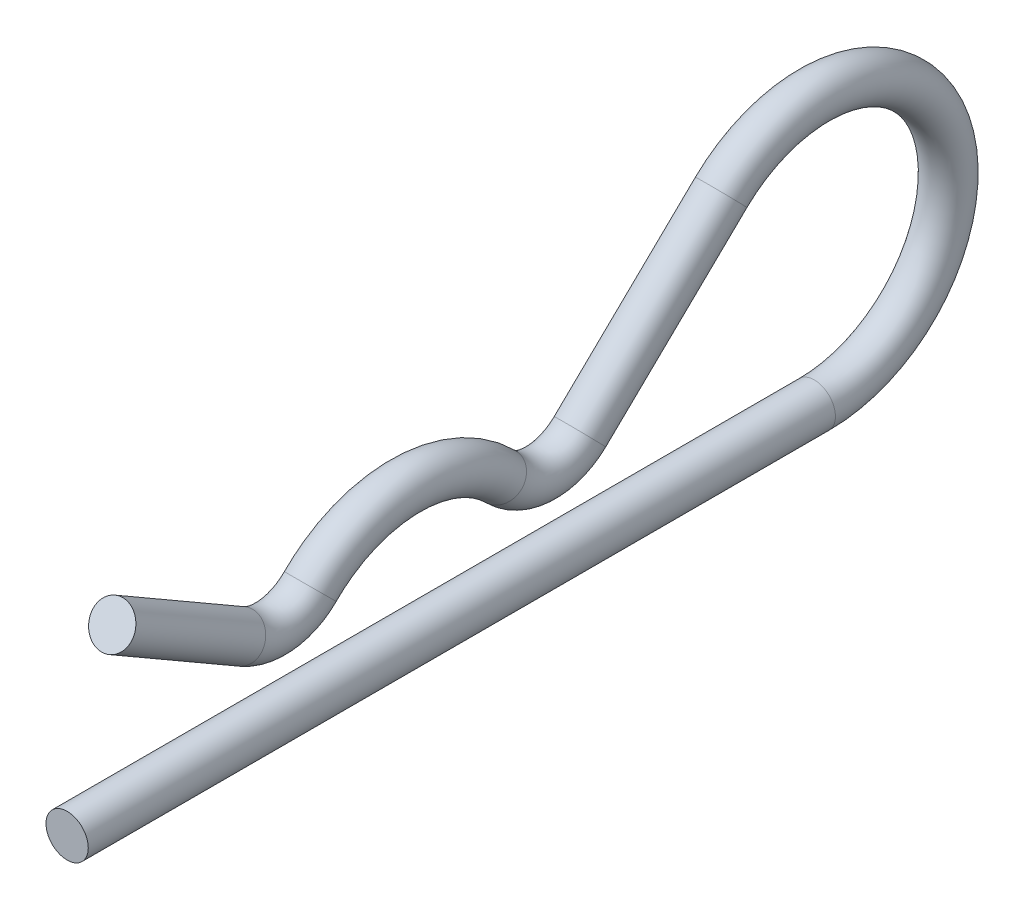
ISO-10303-21;
HEADER;
FILE_DESCRIPTION(('STEP AP214'),'2;1');
FILE_NAME('part.step','',(''),(''),'','','');
FILE_SCHEMA(('AUTOMOTIVE_DESIGN { 1 0 10303 214 1 1 1 1 }'));
ENDSEC;
DATA;
#1=APPLICATION_CONTEXT('core data for automotive mechanical design processes');
#2=APPLICATION_PROTOCOL_DEFINITION('international standard','automotive_design',2000,#1);
#3=PRODUCT_CONTEXT('',#1,'mechanical');
#4=PRODUCT('Part','Part','',(#3));
#5=PRODUCT_RELATED_PRODUCT_CATEGORY('part','',(#4));
#6=PRODUCT_DEFINITION_FORMATION('','',#4);
#7=PRODUCT_DEFINITION_CONTEXT('part definition',#1,'design');
#8=PRODUCT_DEFINITION('design','',#6,#7);
#9=PRODUCT_DEFINITION_SHAPE('','',#8);
#10=(LENGTH_UNIT() NAMED_UNIT(*) SI_UNIT(.MILLI.,.METRE.));
#11=(NAMED_UNIT(*) PLANE_ANGLE_UNIT() SI_UNIT($,.RADIAN.));
#12=(NAMED_UNIT(*) SI_UNIT($,.STERADIAN.) SOLID_ANGLE_UNIT());
#13=UNCERTAINTY_MEASURE_WITH_UNIT(LENGTH_MEASURE(1.E-05),#10,'distance_accuracy_value','');
#14=(GEOMETRIC_REPRESENTATION_CONTEXT(3) GLOBAL_UNCERTAINTY_ASSIGNED_CONTEXT((#13)) GLOBAL_UNIT_ASSIGNED_CONTEXT((#10,
#11,#12)) REPRESENTATION_CONTEXT('',''));
#15=CARTESIAN_POINT('',(0.,0.,0.));
#16=DIRECTION('',(0.,0.,1.));
#17=DIRECTION('',(1.,0.,0.));
#18=AXIS2_PLACEMENT_3D('',#15,#16,#17);
#19=CARTESIAN_POINT('',(0.,2.39549717149222,-4.92455872837049));
#20=DIRECTION('',(0.,0.499999999999992,0.866025403784443));
#21=DIRECTION('',(0.,-0.866025403784444,0.499999999999992));
#22=AXIS2_PLACEMENT_3D('',#19,#20,#21);
#23=CYLINDRICAL_SURFACE('',#22,0.5953125);
#24=CARTESIAN_POINT('',(0.,2.39549717149222,-4.92455872837049));
#25=DIRECTION('',(0.,-0.499999999999982,-0.866025403784449));
#26=DIRECTION('',(1.,0.,0.));
#27=AXIS2_PLACEMENT_3D('',#24,#25,#26);
#28=CIRCLE('',#27,0.5953125);
#29=CARTESIAN_POINT('',(0.,1.87994142330179,-4.62690247837051));
#30=VERTEX_POINT('',#29);
#31=EDGE_CURVE('E36',#30,#30,#28,.T.);
#32=CARTESIAN_POINT('',(0.,4.5054576370862,-1.26999999999995));
#33=DIRECTION('',(0.,-0.499999999999982,-0.866025403784449));
#34=DIRECTION('',(1.,0.,0.));
#35=AXIS2_PLACEMENT_3D('',#32,#33,#34);
#36=CIRCLE('',#35,0.5953125);
#37=CARTESIAN_POINT('',(0.,3.98990188889578,-0.972343749999964));
#38=VERTEX_POINT('',#37);
#39=EDGE_CURVE('E10',#38,#38,#36,.T.);
#40=CARTESIAN_POINT('',(0.,1.87994142330179,-4.62690247837051));
#41=CARTESIAN_POINT('',(0.,1.90192017815173,-4.58883415828331));
#42=CARTESIAN_POINT('',(0.,1.92389893300167,-4.55076583819612));
#43=CARTESIAN_POINT('',(0.,1.96785644270154,-4.47462919802173));
#44=CARTESIAN_POINT('',(0.,1.98983519755148,-4.43656087793454));
#45=CARTESIAN_POINT('',(0.,2.03379270725135,-4.36042423776015));
#46=CARTESIAN_POINT('',(0.,2.05577146210129,-4.32235591767296));
#47=CARTESIAN_POINT('',(0.,2.09972897180117,-4.24621927749857));
#48=CARTESIAN_POINT('',(0.,2.1217077266511,-4.20815095741138));
#49=CARTESIAN_POINT('',(0.,2.16566523635098,-4.13201431723699));
#50=CARTESIAN_POINT('',(0.,2.18764399120092,-4.0939459971498));
#51=CARTESIAN_POINT('',(0.,2.23160150090079,-4.01780935697542));
#52=CARTESIAN_POINT('',(0.,2.25358025575073,-3.97974103688822));
#53=CARTESIAN_POINT('',(0.,2.2975377654506,-3.90360439671384));
#54=CARTESIAN_POINT('',(0.,2.31951652030054,-3.86553607662664));
#55=CARTESIAN_POINT('',(0.,2.36347403000041,-3.78939943645226));
#56=CARTESIAN_POINT('',(0.,2.38545278485035,-3.75133111636506));
#57=CARTESIAN_POINT('',(0.,2.42941029455023,-3.67519447619068));
#58=CARTESIAN_POINT('',(0.,2.45138904940016,-3.63712615610348));
#59=CARTESIAN_POINT('',(0.,2.49534655910004,-3.5609895159291));
#60=CARTESIAN_POINT('',(0.,2.51732531394997,-3.5229211958419));
#61=CARTESIAN_POINT('',(0.,2.56128282364985,-3.44678455566752));
#62=CARTESIAN_POINT('',(0.,2.58326157849979,-3.40871623558032));
#63=CARTESIAN_POINT('',(0.,2.62721908819966,-3.33257959540594));
#64=CARTESIAN_POINT('',(0.,2.6491978430496,-3.29451127531875));
#65=CARTESIAN_POINT('',(0.,2.69315535274947,-3.21837463514436));
#66=CARTESIAN_POINT('',(0.,2.71513410759941,-3.18030631505717));
#67=CARTESIAN_POINT('',(0.,2.75909161729929,-3.10416967488278));
#68=CARTESIAN_POINT('',(0.,2.78107037214922,-3.06610135479559));
#69=CARTESIAN_POINT('',(0.,2.8250278818491,-2.9899647146212));
#70=CARTESIAN_POINT('',(0.,2.84700663669903,-2.95189639453401));
#71=CARTESIAN_POINT('',(0.,2.89096414639891,-2.87575975435962));
#72=CARTESIAN_POINT('',(0.,2.91294290124885,-2.83769143427243));
#73=CARTESIAN_POINT('',(0.,2.95690041094872,-2.76155479409804));
#74=CARTESIAN_POINT('',(0.,2.97887916579866,-2.72348647401085));
#75=CARTESIAN_POINT('',(0.,3.02283667549853,-2.64734983383646));
#76=CARTESIAN_POINT('',(0.,3.04481543034847,-2.60928151374927));
#77=CARTESIAN_POINT('',(0.,3.08877294004835,-2.53314487357488));
#78=CARTESIAN_POINT('',(0.,3.11075169489828,-2.49507655348769));
#79=CARTESIAN_POINT('',(0.,3.15470920459816,-2.4189399133133));
#80=CARTESIAN_POINT('',(0.,3.17668795944809,-2.38087159322611));
#81=CARTESIAN_POINT('',(0.,3.22064546914797,-2.30473495305172));
#82=CARTESIAN_POINT('',(0.,3.24262422399791,-2.26666663296453));
#83=CARTESIAN_POINT('',(0.,3.28658173369778,-2.19052999279014));
#84=CARTESIAN_POINT('',(0.,3.30856048854772,-2.15246167270295));
#85=CARTESIAN_POINT('',(0.,3.35251799824759,-2.07632503252856));
#86=CARTESIAN_POINT('',(0.,3.37449675309753,-2.03825671244137));
#87=CARTESIAN_POINT('',(0.,3.4184542627974,-1.96212007226699));
#88=CARTESIAN_POINT('',(0.,3.44043301764734,-1.92405175217979));
#89=CARTESIAN_POINT('',(0.,3.48439052734722,-1.84791511200541));
#90=CARTESIAN_POINT('',(0.,3.50636928219715,-1.80984679191821));
#91=CARTESIAN_POINT('',(0.,3.55032679189703,-1.73371015174383));
#92=CARTESIAN_POINT('',(0.,3.57230554674697,-1.69564183165663));
#93=CARTESIAN_POINT('',(0.,3.61626305644684,-1.61950519148225));
#94=CARTESIAN_POINT('',(0.,3.63824181129678,-1.58143687139505));
#95=CARTESIAN_POINT('',(0.,3.68219932099665,-1.50530023122067));
#96=CARTESIAN_POINT('',(0.,3.70417807584659,-1.46723191113347));
#97=CARTESIAN_POINT('',(0.,3.74813558554646,-1.39109527095909));
#98=CARTESIAN_POINT('',(0.,3.7701143403964,-1.35302695087189));
#99=CARTESIAN_POINT('',(0.,3.81407185009628,-1.27689031069751));
#100=CARTESIAN_POINT('',(0.,3.83605060494621,-1.23882199061032));
#101=CARTESIAN_POINT('',(0.,3.88000811464609,-1.16268535043593));
#102=CARTESIAN_POINT('',(0.,3.90198686949603,-1.12461703034874));
#103=CARTESIAN_POINT('',(0.,3.9459443791959,-1.04848039017435));
#104=CARTESIAN_POINT('',(0.,3.96792313404584,-1.01041207008716));
#105=CARTESIAN_POINT('',(0.,3.98990188889578,-0.972343749999964));
#106=B_SPLINE_CURVE_WITH_KNOTS('',3,(#40,#41,#42,#43,#44,#45,#46,#47,#48,#49,#50,#51,#52,#53,
#54,#55,#56,#57,#58,#59,#60,#61,#62,#63,#64,#65,#66,#67,#68,#69,#70,#71,#72,#73,#74,#75,#76,#77,
#78,#79,#80,#81,#82,#83,#84,#85,#86,#87,#88,#89,#90,#91,#92,#93,#94,#95,#96,#97,#98,#99,#100,
#101,#102,#103,#104,#105),.UNSPECIFIED.,.F.,.F.,(4,2,2,2,2,2,2,2,2,2,2,2,2,2,2,2,2,2,2,2,2,2,2,
2,2,2,2,2,2,2,2,2,4),(0.,0.131872529099626,0.263745058199252,0.395617587298878,
0.527490116398504,0.65936264549813,0.791235174597756,0.923107703697382,1.05498023279701,
1.18685276189663,1.31872529099626,1.45059782009589,1.58247034919551,1.71434287829514,
1.84621540739476,1.97808793649439,2.10996046559402,2.24183299469364,2.37370552379327,
2.50557805289289,2.63745058199252,2.76932311109215,2.90119564019177,3.0330681692914,
3.16494069839103,3.29681322749065,3.42868575659028,3.5605582856899,3.69243081478953,
3.82430334388916,3.95617587298878,4.08804840208841,4.21992093118803),.UNSPECIFIED.);
#107=EDGE_CURVE('BSEAM30',#30,#38,#106,.T.);
#108=ORIENTED_EDGE('',*,*,#31,.F.);
#109=ORIENTED_EDGE('',*,*,#39,.T.);
#110=ORIENTED_EDGE('',*,*,#107,.T.);
#111=ORIENTED_EDGE('',*,*,#107,.F.);
#112=EDGE_LOOP('',(#108,#110,#109,#111));
#113=FACE_BOUND('',#112,.T.);
#114=ADVANCED_FACE('F30',(#113),#23,.T.);
#115=CARTESIAN_POINT('',(0.,3.7703125,-5.71830872837053));
#116=DIRECTION('',(-1.,0.,0.));
#117=DIRECTION('',(0.,0.,1.));
#118=AXIS2_PLACEMENT_3D('',#115,#116,#117);
#119=TOROIDAL_SURFACE('',#118,1.5875,0.5953125);
#120=CARTESIAN_POINT('',(0.,2.65318287037033,-6.84621725329774));
#121=DIRECTION('',(0.,0.7104935590093,-0.703703703703695));
#122=DIRECTION('',(1.,0.,0.));
#123=AXIS2_PLACEMENT_3D('',#120,#121,#122);
#124=CIRCLE('',#123,0.5953125);
#125=CARTESIAN_POINT('',(0.,2.23425925925921,-7.26918295014544));
#126=VERTEX_POINT('',#125);
#127=EDGE_CURVE('E40',#126,#126,#124,.T.);
#128=CARTESIAN_POINT('',(0.,3.7703125,-5.71830872837053));
#129=DIRECTION('',(-1.,0.,0.));
#130=DIRECTION('',(0.,0.,1.));
#131=AXIS2_PLACEMENT_3D('',#128,#129,#130);
#132=CIRCLE('',#131,2.1828125);
#133=EDGE_CURVE('',#126,#30,#132,.T.);
#134=ORIENTED_EDGE('',*,*,#127,.F.);
#135=ORIENTED_EDGE('',*,*,#31,.T.);
#136=ORIENTED_EDGE('',*,*,#133,.T.);
#137=ORIENTED_EDGE('',*,*,#133,.F.);
#138=EDGE_LOOP('',(#134,#136,#135,#137));
#139=FACE_BOUND('',#138,.T.);
#140=ADVANCED_FACE('F86',(#139),#119,.T.);
#141=CARTESIAN_POINT('',(0.,0.,-9.525));
#142=DIRECTION('',(1.,0.,0.));
#143=DIRECTION('',(0.,0.,-1.));
#144=AXIS2_PLACEMENT_3D('',#141,#142,#143);
#145=TOROIDAL_SURFACE('',#144,3.7703125,0.5953125);
#146=CARTESIAN_POINT('',(0.,2.65318287037041,-12.2037827467022));
#147=DIRECTION('',(0.,-0.710493559009283,-0.703703703703712));
#148=DIRECTION('',(1.,0.,0.));
#149=AXIS2_PLACEMENT_3D('',#146,#147,#148);
#150=CIRCLE('',#149,0.5953125);
#151=CARTESIAN_POINT('',(0.,2.23425925925931,-11.7808170498544));
#152=VERTEX_POINT('',#151);
#153=EDGE_CURVE('E44',#152,#152,#150,.T.);
#154=ORIENTED_EDGE('',*,*,#153,.F.);
#155=EDGE_LOOP('',(#154));
#156=FACE_BOUND('',#155,.T.);
#157=ORIENTED_EDGE('',*,*,#127,.T.);
#158=EDGE_LOOP('',(#157));
#159=FACE_BOUND('',#158,.T.);
#160=ADVANCED_FACE('F80',(#156,#159),#145,.T.);
#161=CARTESIAN_POINT('',(0.,3.7703125,-13.3316912716295));
#162=DIRECTION('',(-1.,0.,0.));
#163=DIRECTION('',(0.,0.,1.));
#164=AXIS2_PLACEMENT_3D('',#161,#162,#163);
#165=TOROIDAL_SURFACE('',#164,1.5875,0.5953125);
#166=CARTESIAN_POINT('',(0.,2.62977122695348,-14.4359203486227));
#167=DIRECTION('',(0.,0.69557737133438,-0.718451195619824));
#168=DIRECTION('',(1.,0.,0.));
#169=AXIS2_PLACEMENT_3D('',#166,#167,#168);
#170=CIRCLE('',#169,0.5953125);
#171=CARTESIAN_POINT('',(0.,2.20206824956103,-14.8500062524952));
#172=VERTEX_POINT('',#171);
#173=EDGE_CURVE('E49',#172,#172,#170,.T.);
#174=CARTESIAN_POINT('',(0.,3.7703125,-13.3316912716295));
#175=DIRECTION('',(-1.,0.,0.));
#176=DIRECTION('',(0.,0.,1.));
#177=AXIS2_PLACEMENT_3D('',#174,#175,#176);
#178=CIRCLE('',#177,2.1828125);
#179=EDGE_CURVE('',#172,#152,#178,.T.);
#180=ORIENTED_EDGE('',*,*,#173,.F.);
#181=ORIENTED_EDGE('',*,*,#153,.T.);
#182=ORIENTED_EDGE('',*,*,#179,.T.);
#183=ORIENTED_EDGE('',*,*,#179,.F.);
#184=EDGE_LOOP('',(#180,#182,#181,#183));
#185=FACE_BOUND('',#184,.T.);
#186=ADVANCED_FACE('F74',(#185),#165,.T.);
#187=CARTESIAN_POINT('',(0.,6.47909802348536,-18.4118309421408));
#188=DIRECTION('',(0.,-0.69557737133437,0.718451195619833));
#189=DIRECTION('',(0.,-0.718451195619833,-0.69557737133437));
#190=AXIS2_PLACEMENT_3D('',#187,#188,#189);
#191=CYLINDRICAL_SURFACE('',#190,0.5953125);
#192=CARTESIAN_POINT('',(0.,6.47909802348536,-18.4118309421408));
#193=DIRECTION('',(0.,0.69557737133438,-0.718451195619824));
#194=DIRECTION('',(1.,0.,0.));
#195=AXIS2_PLACEMENT_3D('',#192,#193,#194);
#196=CIRCLE('',#195,0.5953125);
#197=CARTESIAN_POINT('',(0.,6.90680100087779,-17.9977450382683));
#198=VERTEX_POINT('',#197);
#199=EDGE_CURVE('E52',#198,#198,#196,.T.);
#200=ORIENTED_EDGE('',*,*,#199,.F.);
#201=EDGE_LOOP('',(#200));
#202=FACE_BOUND('',#201,.T.);
#203=ORIENTED_EDGE('',*,*,#173,.T.);
#204=EDGE_LOOP('',(#203));
#205=FACE_BOUND('',#204,.T.);
#206=ADVANCED_FACE('F68',(#202,#205),#191,.T.);
#207=CARTESIAN_POINT('',(0.,3.7703125,-21.034375));
#208=DIRECTION('',(1.,0.,0.));
#209=DIRECTION('',(0.,0.,-1.));
#210=AXIS2_PLACEMENT_3D('',#207,#208,#209);
#211=TOROIDAL_SURFACE('',#210,3.77031249999999,0.5953125);
#212=CARTESIAN_POINT('',(0.,0.,-21.034375));
#213=DIRECTION('',(0.,0.,1.));
#214=DIRECTION('',(1.,0.,0.));
#215=AXIS2_PLACEMENT_3D('',#212,#213,#214);
#216=CIRCLE('',#215,0.5953125);
#217=CARTESIAN_POINT('',(0.,-0.595312499999997,-21.034375));
#218=VERTEX_POINT('',#217);
#219=EDGE_CURVE('E55',#218,#218,#216,.T.);
#220=CARTESIAN_POINT('',(0.,3.7703125,-21.034375));
#221=DIRECTION('',(1.,0.,0.));
#222=DIRECTION('',(0.,0.,-1.));
#223=AXIS2_PLACEMENT_3D('',#220,#221,#222);
#224=CIRCLE('',#223,4.365625);
#225=EDGE_CURVE('',#218,#198,#224,.T.);
#226=ORIENTED_EDGE('',*,*,#219,.F.);
#227=ORIENTED_EDGE('',*,*,#199,.T.);
#228=ORIENTED_EDGE('',*,*,#225,.T.);
#229=ORIENTED_EDGE('',*,*,#225,.F.);
#230=EDGE_LOOP('',(#226,#228,#227,#229));
#231=FACE_BOUND('',#230,.T.);
#232=ADVANCED_FACE('F65',(#231),#211,.T.);
#233=CARTESIAN_POINT('',(0.,0.,-21.034375));
#234=DIRECTION('',(0.,0.,1.));
#235=DIRECTION('',(0.,-1.,0.));
#236=AXIS2_PLACEMENT_3D('',#233,#234,#235);
#237=CYLINDRICAL_SURFACE('',#236,0.5953125);
#238=ORIENTED_EDGE('',*,*,#219,.T.);
#239=EDGE_LOOP('',(#238));
#240=FACE_BOUND('',#239,.T.);
#241=CARTESIAN_POINT('',(0.,0.,0.));
#242=DIRECTION('',(0.,0.,1.));
#243=DIRECTION('',(1.,0.,0.));
#244=AXIS2_PLACEMENT_3D('',#241,#242,#243);
#245=CIRCLE('',#244,0.5953125);
#246=CARTESIAN_POINT('',(0.5953125,0.,0.));
#247=VERTEX_POINT('',#246);
#248=EDGE_CURVE('E56',#247,#247,#245,.T.);
#249=ORIENTED_EDGE('',*,*,#248,.F.);
#250=EDGE_LOOP('',(#249));
#251=FACE_BOUND('',#250,.T.);
#252=ADVANCED_FACE('F62',(#240,#251),#237,.T.);
#253=CARTESIAN_POINT('',(0.,4.5054576370862,-1.26999999999995));
#254=DIRECTION('',(0.,-0.499999999999982,-0.866025403784449));
#255=DIRECTION('',(1.,0.,0.));
#256=AXIS2_PLACEMENT_3D('',#253,#254,#255);
#257=PLANE('',#256);
#258=ORIENTED_EDGE('',*,*,#39,.F.);
#259=EDGE_LOOP('',(#258));
#260=FACE_BOUND('',#259,.T.);
#261=ADVANCED_FACE('F98',(#260),#257,.F.);
#262=CARTESIAN_POINT('',(0.,0.,0.));
#263=DIRECTION('',(0.,0.,1.));
#264=DIRECTION('',(1.,0.,0.));
#265=AXIS2_PLACEMENT_3D('',#262,#263,#264);
#266=PLANE('',#265);
#267=ORIENTED_EDGE('',*,*,#248,.T.);
#268=EDGE_LOOP('',(#267));
#269=FACE_BOUND('',#268,.T.);
#270=ADVANCED_FACE('F99',(#269),#266,.T.);
#271=CLOSED_SHELL('',(#114,#140,#160,#186,#206,#232,#252,#261,#270));
#272=MANIFOLD_SOLID_BREP('B2',#271);
#273=ADVANCED_BREP_SHAPE_REPRESENTATION('',(#18,#272),#14);
#274=SHAPE_DEFINITION_REPRESENTATION(#9,#273);
ENDSEC;
END-ISO-10303-21;
